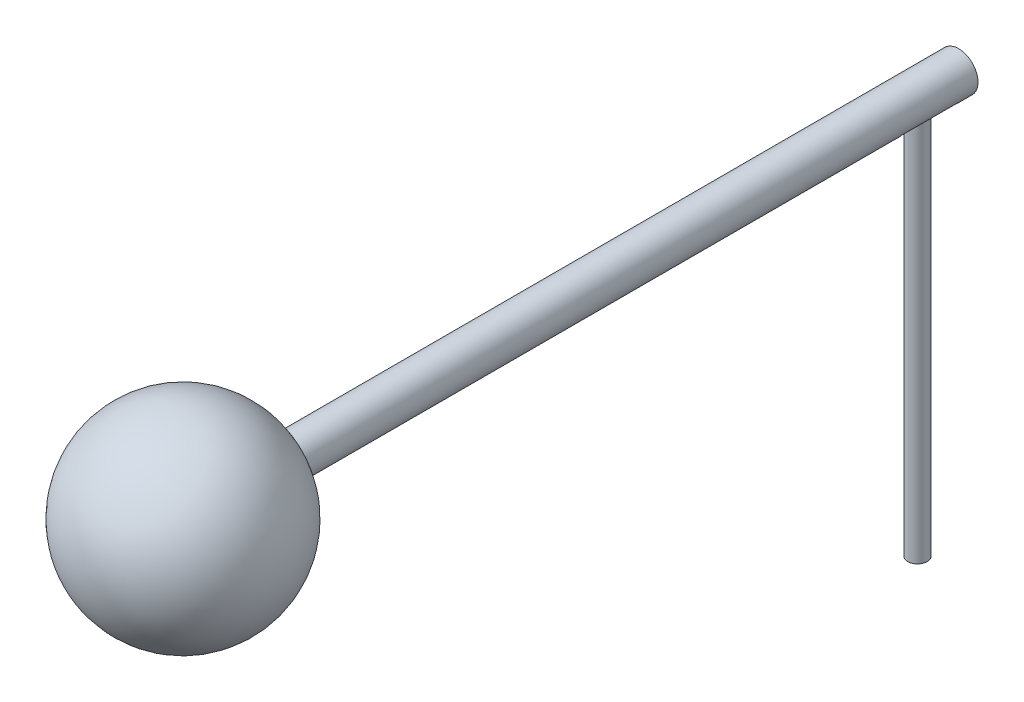
ISO-10303-21;
HEADER;
FILE_DESCRIPTION(('STEP AP214'),'2;1');
FILE_NAME('part.step','',(''),(''),'','','');
FILE_SCHEMA(('AUTOMOTIVE_DESIGN { 1 0 10303 214 1 1 1 1 }'));
ENDSEC;
DATA;
#1=APPLICATION_CONTEXT('core data for automotive mechanical design processes');
#2=APPLICATION_PROTOCOL_DEFINITION('international standard','automotive_design',2000,#1);
#3=PRODUCT_CONTEXT('',#1,'mechanical');
#4=PRODUCT('Part','Part','',(#3));
#5=PRODUCT_RELATED_PRODUCT_CATEGORY('part','',(#4));
#6=PRODUCT_DEFINITION_FORMATION('','',#4);
#7=PRODUCT_DEFINITION_CONTEXT('part definition',#1,'design');
#8=PRODUCT_DEFINITION('design','',#6,#7);
#9=PRODUCT_DEFINITION_SHAPE('','',#8);
#10=(LENGTH_UNIT() NAMED_UNIT(*) SI_UNIT(.MILLI.,.METRE.));
#11=(NAMED_UNIT(*) PLANE_ANGLE_UNIT() SI_UNIT($,.RADIAN.));
#12=(NAMED_UNIT(*) SI_UNIT($,.STERADIAN.) SOLID_ANGLE_UNIT());
#13=UNCERTAINTY_MEASURE_WITH_UNIT(LENGTH_MEASURE(1.E-05),#10,'distance_accuracy_value','');
#14=(GEOMETRIC_REPRESENTATION_CONTEXT(3) GLOBAL_UNCERTAINTY_ASSIGNED_CONTEXT((#13)) GLOBAL_UNIT_ASSIGNED_CONTEXT((#10,
#11,#12)) REPRESENTATION_CONTEXT('',''));
#15=CARTESIAN_POINT('',(0.,0.,0.));
#16=DIRECTION('',(0.,0.,1.));
#17=DIRECTION('',(1.,0.,0.));
#18=AXIS2_PLACEMENT_3D('',#15,#16,#17);
#19=CARTESIAN_POINT('',(0.,-103.,10.6051911141696));
#20=DIRECTION('',(0.,1.,0.));
#21=DIRECTION('',(1.,0.,0.));
#22=AXIS2_PLACEMENT_3D('',#19,#20,#21);
#23=PLANE('',#22);
#24=CARTESIAN_POINT('',(0.,-103.,10.6051911141696));
#25=DIRECTION('',(0.,1.,0.));
#26=DIRECTION('',(1.,0.,0.));
#27=AXIS2_PLACEMENT_3D('',#24,#25,#26);
#28=CIRCLE('',#27,2.5);
#29=CARTESIAN_POINT('',(2.5,-103.,10.6051911141696));
#30=VERTEX_POINT('',#29);
#31=EDGE_CURVE('E10',#30,#30,#28,.T.);
#32=ORIENTED_EDGE('',*,*,#31,.F.);
#33=EDGE_LOOP('',(#32));
#34=FACE_BOUND('',#33,.T.);
#35=ADVANCED_FACE('F16',(#34),#23,.F.);
#36=CARTESIAN_POINT('',(0.,-103.,10.6051911141696));
#37=DIRECTION('',(0.,1.,0.));
#38=DIRECTION('',(-1.,0.,0.));
#39=AXIS2_PLACEMENT_3D('',#36,#37,#38);
#40=CYLINDRICAL_SURFACE('',#39,2.5);
#41=CARTESIAN_POINT('',(0.,-3.,10.6051911141696));
#42=DIRECTION('',(0.,-1.,0.));
#43=DIRECTION('',(1.,0.,0.));
#44=AXIS2_PLACEMENT_3D('',#41,#42,#43);
#45=CIRCLE('',#44,2.5);
#46=CARTESIAN_POINT('',(2.5,-3.,10.6051911141696));
#47=VERTEX_POINT('',#46);
#48=EDGE_CURVE('E19',#47,#47,#45,.T.);
#49=ORIENTED_EDGE('',*,*,#48,.T.);
#50=EDGE_LOOP('',(#49));
#51=FACE_BOUND('',#50,.T.);
#52=ORIENTED_EDGE('',*,*,#31,.T.);
#53=EDGE_LOOP('',(#52));
#54=FACE_BOUND('',#53,.T.);
#55=ADVANCED_FACE('F109',(#51,#54),#40,.T.);
#56=CARTESIAN_POINT('',(-4.74113189811159,-3.,3.96323828942932));
#57=DIRECTION('',(0.,0.,-1.));
#58=DIRECTION('',(0.,-1.,0.));
#59=AXIS2_PLACEMENT_3D('',#56,#57,#58);
#60=PLANE('',#59);
#61=DIRECTION('',(1.,0.,0.));
#62=VECTOR('',#61,1.);
#63=CARTESIAN_POINT('',(-4.74113189811159,-3.,3.96323828942932));
#64=LINE('',#63,#62);
#65=CARTESIAN_POINT('',(-4.,-3.,3.96323828942932));
#66=VERTEX_POINT('',#65);
#67=CARTESIAN_POINT('',(4.,-3.,3.96323828942932));
#68=VERTEX_POINT('',#67);
#69=EDGE_CURVE('E26',#66,#68,#64,.T.);
#70=ORIENTED_EDGE('',*,*,#69,.F.);
#71=CARTESIAN_POINT('',(0.,0.,3.96323828942932));
#72=DIRECTION('',(0.,0.,1.));
#73=DIRECTION('',(-1.,0.,0.));
#74=AXIS2_PLACEMENT_3D('',#71,#72,#73);
#75=CIRCLE('',#74,5.);
#76=EDGE_CURVE('E69',#66,#68,#75,.T.);
#77=ORIENTED_EDGE('',*,*,#76,.T.);
#78=EDGE_LOOP('',(#70,#77));
#79=FACE_BOUND('',#78,.T.);
#80=ADVANCED_FACE('F68',(#79),#60,.F.);
#81=CARTESIAN_POINT('',(4.87669310872114,-3.,18.7551714697627));
#82=DIRECTION('',(0.,0.,1.));
#83=DIRECTION('',(1.,0.,0.));
#84=AXIS2_PLACEMENT_3D('',#81,#82,#83);
#85=PLANE('',#84);
#86=CARTESIAN_POINT('',(0.,0.,18.7551714697627));
#87=DIRECTION('',(0.,0.,-1.));
#88=DIRECTION('',(1.,0.,0.));
#89=AXIS2_PLACEMENT_3D('',#86,#87,#88);
#90=CIRCLE('',#89,5.);
#91=CARTESIAN_POINT('',(4.,-3.,18.7551714697627));
#92=VERTEX_POINT('',#91);
#93=CARTESIAN_POINT('',(-4.,-3.,18.7551714697627));
#94=VERTEX_POINT('',#93);
#95=EDGE_CURVE('E85',#92,#94,#90,.T.);
#96=ORIENTED_EDGE('',*,*,#95,.T.);
#97=DIRECTION('',(-1.,0.,0.));
#98=VECTOR('',#97,1.);
#99=CARTESIAN_POINT('',(4.87669310872114,-3.,18.7551714697627));
#100=LINE('',#99,#98);
#101=EDGE_CURVE('E56',#92,#94,#100,.T.);
#102=ORIENTED_EDGE('',*,*,#101,.F.);
#103=EDGE_LOOP('',(#96,#102));
#104=FACE_BOUND('',#103,.T.);
#105=ADVANCED_FACE('F112',(#104),#85,.F.);
#106=CARTESIAN_POINT('',(0.,-3.,0.));
#107=DIRECTION('',(0.,-1.,0.));
#108=DIRECTION('',(0.,0.,-1.));
#109=AXIS2_PLACEMENT_3D('',#106,#107,#108);
#110=PLANE('',#109);
#111=ORIENTED_EDGE('',*,*,#101,.T.);
#112=DIRECTION('',(0.,0.,1.));
#113=VECTOR('',#112,1.);
#114=CARTESIAN_POINT('',(-4.,-3.,-20.));
#115=LINE('',#114,#113);
#116=EDGE_CURVE('E78',#66,#94,#115,.T.);
#117=ORIENTED_EDGE('',*,*,#116,.F.);
#118=ORIENTED_EDGE('',*,*,#69,.T.);
#119=DIRECTION('',(0.,0.,-1.));
#120=VECTOR('',#119,1.);
#121=CARTESIAN_POINT('',(4.,-3.,-20.));
#122=LINE('',#121,#120);
#123=EDGE_CURVE('E79',#92,#68,#122,.T.);
#124=ORIENTED_EDGE('',*,*,#123,.F.);
#125=EDGE_LOOP('',(#111,#117,#118,#124));
#126=FACE_BOUND('',#125,.T.);
#127=ORIENTED_EDGE('',*,*,#48,.F.);
#128=EDGE_LOOP('',(#127));
#129=FACE_BOUND('',#128,.T.);
#130=ADVANCED_FACE('F82',(#126,#129),#110,.T.);
#131=CARTESIAN_POINT('',(0.,0.,200.));
#132=DIRECTION('',(0.,0.,1.));
#133=DIRECTION('',(-1.,0.,0.));
#134=AXIS2_PLACEMENT_3D('',#131,#132,#133);
#135=SPHERICAL_SURFACE('',#134,25.);
#136=CARTESIAN_POINT('',(0.,0.,175.505102572168));
#137=DIRECTION('',(0.,0.,1.));
#138=DIRECTION('',(1.,0.,0.));
#139=AXIS2_PLACEMENT_3D('',#136,#137,#138);
#140=CIRCLE('',#139,5.);
#141=CARTESIAN_POINT('',(5.,0.,175.505102572168));
#142=VERTEX_POINT('',#141);
#143=EDGE_CURVE('E94',#142,#142,#140,.T.);
#144=ORIENTED_EDGE('',*,*,#143,.T.);
#145=EDGE_LOOP('',(#144));
#146=FACE_BOUND('',#145,.T.);
#147=ADVANCED_FACE('F111',(#146),#135,.T.);
#148=CARTESIAN_POINT('',(5.,0.,0.));
#149=DIRECTION('',(0.,0.,-1.));
#150=DIRECTION('',(0.,-1.,0.));
#151=AXIS2_PLACEMENT_3D('',#148,#149,#150);
#152=PLANE('',#151);
#153=CARTESIAN_POINT('',(0.,0.,0.));
#154=DIRECTION('',(0.,0.,1.));
#155=DIRECTION('',(1.,0.,0.));
#156=AXIS2_PLACEMENT_3D('',#153,#154,#155);
#157=CIRCLE('',#156,5.);
#158=CARTESIAN_POINT('',(5.,0.,0.));
#159=VERTEX_POINT('',#158);
#160=EDGE_CURVE('E86',#159,#159,#157,.T.);
#161=ORIENTED_EDGE('',*,*,#160,.F.);
#162=EDGE_LOOP('',(#161));
#163=FACE_BOUND('',#162,.T.);
#164=ADVANCED_FACE('F119',(#163),#152,.T.);
#165=CARTESIAN_POINT('',(0.,0.,-20.));
#166=DIRECTION('',(0.,0.,1.));
#167=DIRECTION('',(1.,0.,0.));
#168=AXIS2_PLACEMENT_3D('',#165,#166,#167);
#169=CYLINDRICAL_SURFACE('',#168,5.);
#170=ORIENTED_EDGE('',*,*,#116,.T.);
#171=ORIENTED_EDGE('',*,*,#95,.F.);
#172=ORIENTED_EDGE('',*,*,#123,.T.);
#173=ORIENTED_EDGE('',*,*,#76,.F.);
#174=EDGE_LOOP('',(#170,#171,#172,#173));
#175=FACE_BOUND('',#174,.T.);
#176=ORIENTED_EDGE('',*,*,#160,.T.);
#177=EDGE_LOOP('',(#176));
#178=FACE_BOUND('',#177,.T.);
#179=ORIENTED_EDGE('',*,*,#143,.F.);
#180=EDGE_LOOP('',(#179));
#181=FACE_BOUND('',#180,.T.);
#182=ADVANCED_FACE('F75',(#175,#178,#181),#169,.T.);
#183=CLOSED_SHELL('',(#35,#55,#80,#105,#130,#147,#164,#182));
#184=MANIFOLD_SOLID_BREP('B1',#183);
#185=ADVANCED_BREP_SHAPE_REPRESENTATION('',(#18,#184),#14);
#186=SHAPE_DEFINITION_REPRESENTATION(#9,#185);
ENDSEC;
END-ISO-10303-21;
